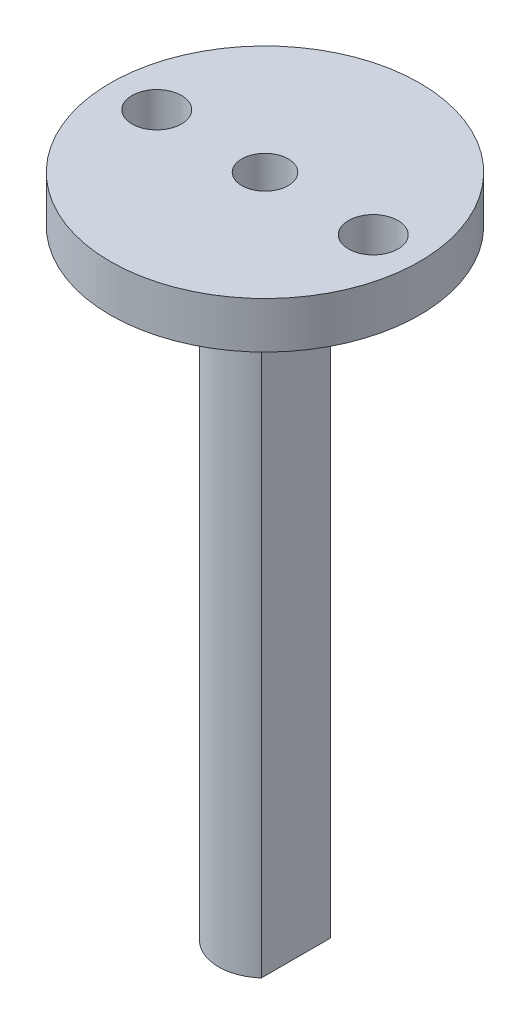
ISO-10303-21;
HEADER;
FILE_DESCRIPTION(('STEP AP214'),'2;1');
FILE_NAME('part.step','',(''),(''),'','','');
FILE_SCHEMA(('AUTOMOTIVE_DESIGN { 1 0 10303 214 1 1 1 1 }'));
ENDSEC;
DATA;
#1=APPLICATION_CONTEXT('core data for automotive mechanical design processes');
#2=APPLICATION_PROTOCOL_DEFINITION('international standard','automotive_design',2000,#1);
#3=PRODUCT_CONTEXT('',#1,'mechanical');
#4=PRODUCT('Part','Part','',(#3));
#5=PRODUCT_RELATED_PRODUCT_CATEGORY('part','',(#4));
#6=PRODUCT_DEFINITION_FORMATION('','',#4);
#7=PRODUCT_DEFINITION_CONTEXT('part definition',#1,'design');
#8=PRODUCT_DEFINITION('design','',#6,#7);
#9=PRODUCT_DEFINITION_SHAPE('','',#8);
#10=(LENGTH_UNIT() NAMED_UNIT(*) SI_UNIT(.MILLI.,.METRE.));
#11=(NAMED_UNIT(*) PLANE_ANGLE_UNIT() SI_UNIT($,.RADIAN.));
#12=(NAMED_UNIT(*) SI_UNIT($,.STERADIAN.) SOLID_ANGLE_UNIT());
#13=UNCERTAINTY_MEASURE_WITH_UNIT(LENGTH_MEASURE(1.E-05),#10,'distance_accuracy_value','');
#14=(GEOMETRIC_REPRESENTATION_CONTEXT(3) GLOBAL_UNCERTAINTY_ASSIGNED_CONTEXT((#13)) GLOBAL_UNIT_ASSIGNED_CONTEXT((#10,
#11,#12)) REPRESENTATION_CONTEXT('',''));
#15=CARTESIAN_POINT('',(0.,0.,0.));
#16=DIRECTION('',(0.,0.,1.));
#17=DIRECTION('',(1.,0.,0.));
#18=AXIS2_PLACEMENT_3D('',#15,#16,#17);
#19=CARTESIAN_POINT('',(0.,0.,0.));
#20=DIRECTION('',(0.,1.,0.));
#21=DIRECTION('',(0.,0.,1.));
#22=AXIS2_PLACEMENT_3D('',#19,#20,#21);
#23=PLANE('',#22);
#24=CARTESIAN_POINT('',(0.,0.,0.));
#25=DIRECTION('',(0.,1.,0.));
#26=DIRECTION('',(0.,0.,1.));
#27=AXIS2_PLACEMENT_3D('',#24,#25,#26);
#28=CIRCLE('',#27,3.);
#29=CARTESIAN_POINT('',(2.,0.,-2.23606797749979));
#30=VERTEX_POINT('',#29);
#31=CARTESIAN_POINT('',(2.,0.,2.23606797749979));
#32=VERTEX_POINT('',#31);
#33=EDGE_CURVE('E77',#30,#32,#28,.T.);
#34=ORIENTED_EDGE('',*,*,#33,.F.);
#35=DIRECTION('',(0.,0.,-1.));
#36=VECTOR('',#35,1.);
#37=CARTESIAN_POINT('',(2.,0.,-2.23606797749979));
#38=LINE('',#37,#36);
#39=EDGE_CURVE('E63',#32,#30,#38,.T.);
#40=ORIENTED_EDGE('',*,*,#39,.F.);
#41=EDGE_LOOP('',(#34,#40));
#42=FACE_BOUND('',#41,.T.);
#43=CARTESIAN_POINT('',(0.,0.,0.));
#44=DIRECTION('',(0.,1.,0.));
#45=DIRECTION('',(0.,0.,1.));
#46=AXIS2_PLACEMENT_3D('',#43,#44,#45);
#47=CIRCLE('',#46,1.5);
#48=CARTESIAN_POINT('',(0.,0.,1.5));
#49=VERTEX_POINT('',#48);
#50=EDGE_CURVE('E79',#49,#49,#47,.T.);
#51=ORIENTED_EDGE('',*,*,#50,.T.);
#52=EDGE_LOOP('',(#51));
#53=FACE_BOUND('',#52,.T.);
#54=ADVANCED_FACE('F39',(#42,#53),#23,.F.);
#55=CARTESIAN_POINT('',(0.,40.,0.));
#56=DIRECTION('',(0.,-1.,0.));
#57=DIRECTION('',(0.,0.,-1.));
#58=AXIS2_PLACEMENT_3D('',#55,#56,#57);
#59=CYLINDRICAL_SURFACE('',#58,3.);
#60=ORIENTED_EDGE('',*,*,#33,.T.);
#61=DIRECTION('',(0.,-1.,0.));
#62=VECTOR('',#61,1.);
#63=CARTESIAN_POINT('',(2.,40.,2.23606797749979));
#64=LINE('',#63,#62);
#65=CARTESIAN_POINT('',(2.,40.,2.23606797749979));
#66=VERTEX_POINT('',#65);
#67=EDGE_CURVE('E11',#66,#32,#64,.T.);
#68=ORIENTED_EDGE('',*,*,#67,.F.);
#69=CARTESIAN_POINT('',(0.,40.,0.));
#70=DIRECTION('',(0.,1.,0.));
#71=DIRECTION('',(0.,0.,1.));
#72=AXIS2_PLACEMENT_3D('',#69,#70,#71);
#73=CIRCLE('',#72,3.);
#74=CARTESIAN_POINT('',(2.,40.,-2.23606797749979));
#75=VERTEX_POINT('',#74);
#76=EDGE_CURVE('E68',#75,#66,#73,.T.);
#77=ORIENTED_EDGE('',*,*,#76,.F.);
#78=DIRECTION('',(0.,-1.,0.));
#79=VECTOR('',#78,1.);
#80=CARTESIAN_POINT('',(2.,40.,-2.23606797749979));
#81=LINE('',#80,#79);
#82=EDGE_CURVE('E48',#75,#30,#81,.T.);
#83=ORIENTED_EDGE('',*,*,#82,.T.);
#84=EDGE_LOOP('',(#60,#68,#77,#83));
#85=FACE_BOUND('',#84,.T.);
#86=ADVANCED_FACE('F41',(#85),#59,.T.);
#87=CARTESIAN_POINT('',(2.,40.,-2.23606797749979));
#88=DIRECTION('',(-1.,0.,0.));
#89=DIRECTION('',(0.,0.,1.));
#90=AXIS2_PLACEMENT_3D('',#87,#88,#89);
#91=PLANE('',#90);
#92=ORIENTED_EDGE('',*,*,#39,.T.);
#93=ORIENTED_EDGE('',*,*,#82,.F.);
#94=DIRECTION('',(0.,0.,-1.));
#95=VECTOR('',#94,1.);
#96=CARTESIAN_POINT('',(2.,40.,-2.23606797749979));
#97=LINE('',#96,#95);
#98=EDGE_CURVE('E54',#66,#75,#97,.T.);
#99=ORIENTED_EDGE('',*,*,#98,.F.);
#100=ORIENTED_EDGE('',*,*,#67,.T.);
#101=EDGE_LOOP('',(#92,#93,#99,#100));
#102=FACE_BOUND('',#101,.T.);
#103=ADVANCED_FACE('F72',(#102),#91,.F.);
#104=CARTESIAN_POINT('',(0.,40.,0.));
#105=DIRECTION('',(0.,-1.,0.));
#106=DIRECTION('',(0.,0.,-1.));
#107=AXIS2_PLACEMENT_3D('',#104,#105,#106);
#108=CYLINDRICAL_SURFACE('',#107,1.5);
#109=ORIENTED_EDGE('',*,*,#50,.F.);
#110=EDGE_LOOP('',(#109));
#111=FACE_BOUND('',#110,.T.);
#112=CARTESIAN_POINT('',(0.,43.,0.));
#113=DIRECTION('',(0.,1.,0.));
#114=DIRECTION('',(0.,0.,1.));
#115=AXIS2_PLACEMENT_3D('',#112,#113,#114);
#116=CIRCLE('',#115,1.5);
#117=CARTESIAN_POINT('',(0.,43.,1.5));
#118=VERTEX_POINT('',#117);
#119=EDGE_CURVE('E100',#118,#118,#116,.T.);
#120=ORIENTED_EDGE('',*,*,#119,.T.);
#121=EDGE_LOOP('',(#120));
#122=FACE_BOUND('',#121,.T.);
#123=ADVANCED_FACE('F106',(#111,#122),#108,.F.);
#124=CARTESIAN_POINT('',(0.,40.,0.));
#125=DIRECTION('',(0.,1.,0.));
#126=DIRECTION('',(0.,0.,1.));
#127=AXIS2_PLACEMENT_3D('',#124,#125,#126);
#128=PLANE('',#127);
#129=CARTESIAN_POINT('',(7.,40.,0.));
#130=DIRECTION('',(0.,1.,0.));
#131=DIRECTION('',(0.,0.,1.));
#132=AXIS2_PLACEMENT_3D('',#129,#130,#131);
#133=CIRCLE('',#132,1.6);
#134=CARTESIAN_POINT('',(7.,40.,1.6));
#135=VERTEX_POINT('',#134);
#136=EDGE_CURVE('E97',#135,#135,#133,.T.);
#137=ORIENTED_EDGE('',*,*,#136,.T.);
#138=EDGE_LOOP('',(#137));
#139=FACE_BOUND('',#138,.T.);
#140=CARTESIAN_POINT('',(-7.,40.,0.));
#141=DIRECTION('',(0.,1.,0.));
#142=DIRECTION('',(0.,0.,1.));
#143=AXIS2_PLACEMENT_3D('',#140,#141,#142);
#144=CIRCLE('',#143,1.6);
#145=CARTESIAN_POINT('',(-7.,40.,1.6));
#146=VERTEX_POINT('',#145);
#147=EDGE_CURVE('E91',#146,#146,#144,.T.);
#148=ORIENTED_EDGE('',*,*,#147,.T.);
#149=EDGE_LOOP('',(#148));
#150=FACE_BOUND('',#149,.T.);
#151=CARTESIAN_POINT('',(0.,40.,0.));
#152=DIRECTION('',(0.,1.,0.));
#153=DIRECTION('',(0.,0.,1.));
#154=AXIS2_PLACEMENT_3D('',#151,#152,#153);
#155=CIRCLE('',#154,10.);
#156=CARTESIAN_POINT('',(0.,40.,10.));
#157=VERTEX_POINT('',#156);
#158=EDGE_CURVE('E85',#157,#157,#155,.T.);
#159=ORIENTED_EDGE('',*,*,#158,.F.);
#160=EDGE_LOOP('',(#159));
#161=FACE_BOUND('',#160,.T.);
#162=ORIENTED_EDGE('',*,*,#98,.T.);
#163=ORIENTED_EDGE('',*,*,#76,.T.);
#164=EDGE_LOOP('',(#162,#163));
#165=FACE_BOUND('',#164,.T.);
#166=ADVANCED_FACE('F73',(#139,#150,#161,#165),#128,.F.);
#167=CARTESIAN_POINT('',(0.,43.,0.));
#168=DIRECTION('',(0.,1.,0.));
#169=DIRECTION('',(0.,0.,1.));
#170=AXIS2_PLACEMENT_3D('',#167,#168,#169);
#171=PLANE('',#170);
#172=CARTESIAN_POINT('',(7.,43.,0.));
#173=DIRECTION('',(0.,1.,0.));
#174=DIRECTION('',(0.,0.,1.));
#175=AXIS2_PLACEMENT_3D('',#172,#173,#174);
#176=CIRCLE('',#175,1.6);
#177=CARTESIAN_POINT('',(7.,43.,1.6));
#178=VERTEX_POINT('',#177);
#179=EDGE_CURVE('E94',#178,#178,#176,.T.);
#180=ORIENTED_EDGE('',*,*,#179,.F.);
#181=EDGE_LOOP('',(#180));
#182=FACE_BOUND('',#181,.T.);
#183=CARTESIAN_POINT('',(0.,43.,0.));
#184=DIRECTION('',(0.,1.,0.));
#185=DIRECTION('',(0.,0.,1.));
#186=AXIS2_PLACEMENT_3D('',#183,#184,#185);
#187=CIRCLE('',#186,10.);
#188=CARTESIAN_POINT('',(0.,43.,10.));
#189=VERTEX_POINT('',#188);
#190=EDGE_CURVE('E81',#189,#189,#187,.T.);
#191=ORIENTED_EDGE('',*,*,#190,.T.);
#192=EDGE_LOOP('',(#191));
#193=FACE_BOUND('',#192,.T.);
#194=CARTESIAN_POINT('',(-7.,43.,0.));
#195=DIRECTION('',(0.,1.,0.));
#196=DIRECTION('',(0.,0.,1.));
#197=AXIS2_PLACEMENT_3D('',#194,#195,#196);
#198=CIRCLE('',#197,1.6);
#199=CARTESIAN_POINT('',(-7.,43.,1.6));
#200=VERTEX_POINT('',#199);
#201=EDGE_CURVE('E89',#200,#200,#198,.T.);
#202=ORIENTED_EDGE('',*,*,#201,.F.);
#203=EDGE_LOOP('',(#202));
#204=FACE_BOUND('',#203,.T.);
#205=ORIENTED_EDGE('',*,*,#119,.F.);
#206=EDGE_LOOP('',(#205));
#207=FACE_BOUND('',#206,.T.);
#208=ADVANCED_FACE('F108',(#182,#193,#204,#207),#171,.T.);
#209=CARTESIAN_POINT('',(0.,43.,0.));
#210=DIRECTION('',(0.,-1.,0.));
#211=DIRECTION('',(0.,0.,-1.));
#212=AXIS2_PLACEMENT_3D('',#209,#210,#211);
#213=CYLINDRICAL_SURFACE('',#212,10.);
#214=ORIENTED_EDGE('',*,*,#190,.F.);
#215=EDGE_LOOP('',(#214));
#216=FACE_BOUND('',#215,.T.);
#217=ORIENTED_EDGE('',*,*,#158,.T.);
#218=EDGE_LOOP('',(#217));
#219=FACE_BOUND('',#218,.T.);
#220=ADVANCED_FACE('F110',(#216,#219),#213,.T.);
#221=CARTESIAN_POINT('',(-7.,43.,0.));
#222=DIRECTION('',(0.,-1.,0.));
#223=DIRECTION('',(0.,0.,-1.));
#224=AXIS2_PLACEMENT_3D('',#221,#222,#223);
#225=CYLINDRICAL_SURFACE('',#224,1.6);
#226=ORIENTED_EDGE('',*,*,#201,.T.);
#227=EDGE_LOOP('',(#226));
#228=FACE_BOUND('',#227,.T.);
#229=ORIENTED_EDGE('',*,*,#147,.F.);
#230=EDGE_LOOP('',(#229));
#231=FACE_BOUND('',#230,.T.);
#232=ADVANCED_FACE('F117',(#228,#231),#225,.F.);
#233=CARTESIAN_POINT('',(7.,43.,0.));
#234=DIRECTION('',(0.,-1.,0.));
#235=DIRECTION('',(0.,0.,-1.));
#236=AXIS2_PLACEMENT_3D('',#233,#234,#235);
#237=CYLINDRICAL_SURFACE('',#236,1.6);
#238=ORIENTED_EDGE('',*,*,#179,.T.);
#239=EDGE_LOOP('',(#238));
#240=FACE_BOUND('',#239,.T.);
#241=ORIENTED_EDGE('',*,*,#136,.F.);
#242=EDGE_LOOP('',(#241));
#243=FACE_BOUND('',#242,.T.);
#244=ADVANCED_FACE('F164',(#240,#243),#237,.F.);
#245=CLOSED_SHELL('',(#54,#86,#103,#123,#166,#208,#220,#232,#244));
#246=MANIFOLD_SOLID_BREP('B2',#245);
#247=ADVANCED_BREP_SHAPE_REPRESENTATION('',(#18,#246),#14);
#248=SHAPE_DEFINITION_REPRESENTATION(#9,#247);
ENDSEC;
END-ISO-10303-21;
